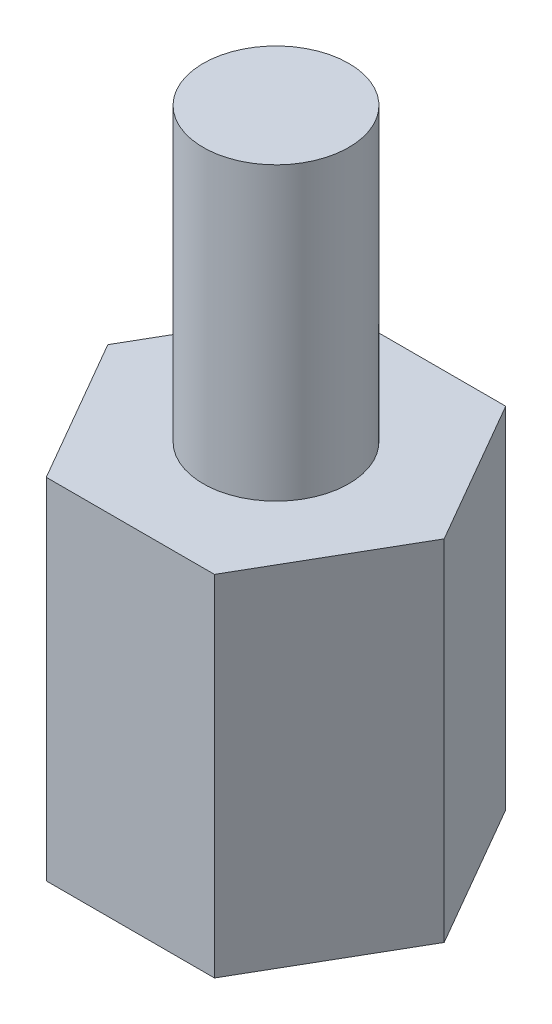
ISO-10303-21;
HEADER;
FILE_DESCRIPTION(('STEP AP214'),'2;1');
FILE_NAME('part.step','',(''),(''),'','','');
FILE_SCHEMA(('AUTOMOTIVE_DESIGN { 1 0 10303 214 1 1 1 1 }'));
ENDSEC;
DATA;
#1=APPLICATION_CONTEXT('core data for automotive mechanical design processes');
#2=APPLICATION_PROTOCOL_DEFINITION('international standard','automotive_design',2000,#1);
#3=PRODUCT_CONTEXT('',#1,'mechanical');
#4=PRODUCT('Part','Part','',(#3));
#5=PRODUCT_RELATED_PRODUCT_CATEGORY('part','',(#4));
#6=PRODUCT_DEFINITION_FORMATION('','',#4);
#7=PRODUCT_DEFINITION_CONTEXT('part definition',#1,'design');
#8=PRODUCT_DEFINITION('design','',#6,#7);
#9=PRODUCT_DEFINITION_SHAPE('','',#8);
#10=(LENGTH_UNIT() NAMED_UNIT(*) SI_UNIT(.MILLI.,.METRE.));
#11=(NAMED_UNIT(*) PLANE_ANGLE_UNIT() SI_UNIT($,.RADIAN.));
#12=(NAMED_UNIT(*) SI_UNIT($,.STERADIAN.) SOLID_ANGLE_UNIT());
#13=UNCERTAINTY_MEASURE_WITH_UNIT(LENGTH_MEASURE(1.E-05),#10,'distance_accuracy_value','');
#14=(GEOMETRIC_REPRESENTATION_CONTEXT(3) GLOBAL_UNCERTAINTY_ASSIGNED_CONTEXT((#13)) GLOBAL_UNIT_ASSIGNED_CONTEXT((#10,
#11,#12)) REPRESENTATION_CONTEXT('',''));
#15=CARTESIAN_POINT('',(0.,0.,0.));
#16=DIRECTION('',(0.,0.,1.));
#17=DIRECTION('',(1.,0.,0.));
#18=AXIS2_PLACEMENT_3D('',#15,#16,#17);
#19=CARTESIAN_POINT('',(0.,11.,0.));
#20=DIRECTION('',(0.,1.,0.));
#21=DIRECTION('',(0.,0.,1.));
#22=AXIS2_PLACEMENT_3D('',#19,#20,#21);
#23=PLANE('',#22);
#24=CARTESIAN_POINT('',(0.,11.,0.));
#25=DIRECTION('',(0.,-1.,0.));
#26=DIRECTION('',(0.,0.,-1.));
#27=AXIS2_PLACEMENT_3D('',#24,#25,#26);
#28=CIRCLE('',#27,1.25);
#29=CARTESIAN_POINT('',(0.,11.,-1.25));
#30=VERTEX_POINT('',#29);
#31=EDGE_CURVE('P0_E18',#30,#30,#28,.T.);
#32=ORIENTED_EDGE('',*,*,#31,.F.);
#33=EDGE_LOOP('',(#32));
#34=FACE_BOUND('',#33,.T.);
#35=ADVANCED_FACE('P0_F15',(#34),#23,.T.);
#36=CARTESIAN_POINT('',(0.,6.,0.));
#37=DIRECTION('',(0.,1.,0.));
#38=DIRECTION('',(0.,0.,1.));
#39=AXIS2_PLACEMENT_3D('',#36,#37,#38);
#40=PLANE('',#39);
#41=CARTESIAN_POINT('',(0.,6.,0.));
#42=DIRECTION('',(0.,-1.,0.));
#43=DIRECTION('',(0.,0.,-1.));
#44=AXIS2_PLACEMENT_3D('',#41,#42,#43);
#45=CIRCLE('',#44,1.25);
#46=CARTESIAN_POINT('',(0.,6.,-1.25));
#47=VERTEX_POINT('',#46);
#48=EDGE_CURVE('P0_E10',#47,#47,#45,.F.);
#49=ORIENTED_EDGE('',*,*,#48,.F.);
#50=EDGE_LOOP('',(#49));
#51=FACE_BOUND('',#50,.T.);
#52=ADVANCED_FACE('P0_F30',(#51),#40,.F.);
#53=CARTESIAN_POINT('',(0.,11.,0.));
#54=DIRECTION('',(0.,-1.,0.));
#55=DIRECTION('',(0.,0.,-1.));
#56=AXIS2_PLACEMENT_3D('',#53,#54,#55);
#57=CYLINDRICAL_SURFACE('',#56,1.25);
#58=ORIENTED_EDGE('',*,*,#48,.T.);
#59=EDGE_LOOP('',(#58));
#60=FACE_BOUND('',#59,.T.);
#61=ORIENTED_EDGE('',*,*,#31,.T.);
#62=EDGE_LOOP('',(#61));
#63=FACE_BOUND('',#62,.T.);
#64=ADVANCED_FACE('P0_F27',(#60,#63),#57,.T.);
#65=CLOSED_SHELL('',(#35,#52,#64));
#66=MANIFOLD_SOLID_BREP('P0_B1',#65);
#67=CARTESIAN_POINT('',(1.44337567297406,6.,2.50000000000001));
#68=DIRECTION('',(-0.866025403784439,0.,-0.5));
#69=DIRECTION('',(-0.5,0.,0.866025403784439));
#70=AXIS2_PLACEMENT_3D('',#67,#68,#69);
#71=PLANE('',#70);
#72=DIRECTION('',(0.,1.,0.));
#73=VECTOR('',#72,1.);
#74=CARTESIAN_POINT('',(2.88675134594813,6.,0.));
#75=LINE('',#74,#73);
#76=CARTESIAN_POINT('',(2.88675134594813,0.,0.));
#77=VERTEX_POINT('',#76);
#78=CARTESIAN_POINT('',(2.88675134594813,6.,0.));
#79=VERTEX_POINT('',#78);
#80=EDGE_CURVE('P1_E66',#77,#79,#75,.T.);
#81=ORIENTED_EDGE('',*,*,#80,.T.);
#82=DIRECTION('',(0.5,0.,-0.866025403784439));
#83=VECTOR('',#82,1.);
#84=CARTESIAN_POINT('',(1.44337567297406,6.,2.50000000000001));
#85=LINE('',#84,#83);
#86=CARTESIAN_POINT('',(1.44337567297406,6.,2.50000000000001));
#87=VERTEX_POINT('',#86);
#88=EDGE_CURVE('P1_E106',#87,#79,#85,.T.);
#89=ORIENTED_EDGE('',*,*,#88,.F.);
#90=DIRECTION('',(0.,1.,0.));
#91=VECTOR('',#90,1.);
#92=CARTESIAN_POINT('',(1.44337567297406,6.,2.50000000000001));
#93=LINE('',#92,#91);
#94=CARTESIAN_POINT('',(1.44337567297406,0.,2.50000000000001));
#95=VERTEX_POINT('',#94);
#96=EDGE_CURVE('P1_E93',#87,#95,#93,.F.);
#97=ORIENTED_EDGE('',*,*,#96,.T.);
#98=DIRECTION('',(0.5,0.,-0.866025403784439));
#99=VECTOR('',#98,1.);
#100=CARTESIAN_POINT('',(1.44337567297406,0.,2.50000000000001));
#101=LINE('',#100,#99);
#102=EDGE_CURVE('P1_E107',#95,#77,#101,.T.);
#103=ORIENTED_EDGE('',*,*,#102,.T.);
#104=EDGE_LOOP('',(#81,#89,#97,#103));
#105=FACE_BOUND('',#104,.T.);
#106=ADVANCED_FACE('P1_F17',(#105),#71,.F.);
#107=CARTESIAN_POINT('',(2.88675134594813,6.,0.));
#108=DIRECTION('',(-0.866025403784439,0.,0.5));
#109=DIRECTION('',(0.5,0.,0.866025403784439));
#110=AXIS2_PLACEMENT_3D('',#107,#108,#109);
#111=PLANE('',#110);
#112=DIRECTION('',(0.,1.,0.));
#113=VECTOR('',#112,1.);
#114=CARTESIAN_POINT('',(1.44337567297406,6.,-2.50000000000001));
#115=LINE('',#114,#113);
#116=CARTESIAN_POINT('',(1.44337567297406,0.,-2.50000000000001));
#117=VERTEX_POINT('',#116);
#118=CARTESIAN_POINT('',(1.44337567297406,6.,-2.50000000000001));
#119=VERTEX_POINT('',#118);
#120=EDGE_CURVE('P1_E73',#117,#119,#115,.T.);
#121=ORIENTED_EDGE('',*,*,#120,.T.);
#122=DIRECTION('',(-0.5,0.,-0.866025403784439));
#123=VECTOR('',#122,1.);
#124=CARTESIAN_POINT('',(2.88675134594813,6.,0.));
#125=LINE('',#124,#123);
#126=EDGE_CURVE('P1_E108',#79,#119,#125,.T.);
#127=ORIENTED_EDGE('',*,*,#126,.F.);
#128=ORIENTED_EDGE('',*,*,#80,.F.);
#129=DIRECTION('',(-0.5,0.,-0.866025403784439));
#130=VECTOR('',#129,1.);
#131=CARTESIAN_POINT('',(2.88675134594813,0.,0.));
#132=LINE('',#131,#130);
#133=EDGE_CURVE('P1_E86',#77,#117,#132,.T.);
#134=ORIENTED_EDGE('',*,*,#133,.T.);
#135=EDGE_LOOP('',(#121,#127,#128,#134));
#136=FACE_BOUND('',#135,.T.);
#137=ADVANCED_FACE('P1_F92',(#136),#111,.F.);
#138=CARTESIAN_POINT('',(1.44337567297406,6.,-2.50000000000001));
#139=DIRECTION('',(0.,0.,1.));
#140=DIRECTION('',(1.,0.,0.));
#141=AXIS2_PLACEMENT_3D('',#138,#139,#140);
#142=PLANE('',#141);
#143=DIRECTION('',(0.,1.,0.));
#144=VECTOR('',#143,1.);
#145=CARTESIAN_POINT('',(-1.44337567297407,6.,-2.50000000000001));
#146=LINE('',#145,#144);
#147=CARTESIAN_POINT('',(-1.44337567297407,0.,-2.50000000000001));
#148=VERTEX_POINT('',#147);
#149=CARTESIAN_POINT('',(-1.44337567297407,6.,-2.50000000000001));
#150=VERTEX_POINT('',#149);
#151=EDGE_CURVE('P1_E79',#148,#150,#146,.T.);
#152=ORIENTED_EDGE('',*,*,#151,.T.);
#153=DIRECTION('',(1.,0.,0.));
#154=VECTOR('',#153,1.);
#155=CARTESIAN_POINT('',(0.,6.,-2.50000000000001));
#156=LINE('',#155,#154);
#157=EDGE_CURVE('P1_E78',#119,#150,#156,.F.);
#158=ORIENTED_EDGE('',*,*,#157,.F.);
#159=ORIENTED_EDGE('',*,*,#120,.F.);
#160=DIRECTION('',(1.,0.,0.));
#161=VECTOR('',#160,1.);
#162=CARTESIAN_POINT('',(0.,0.,-2.50000000000001));
#163=LINE('',#162,#161);
#164=EDGE_CURVE('P1_E77',#117,#148,#163,.F.);
#165=ORIENTED_EDGE('',*,*,#164,.T.);
#166=EDGE_LOOP('',(#152,#158,#159,#165));
#167=FACE_BOUND('',#166,.T.);
#168=ADVANCED_FACE('P1_F76',(#167),#142,.F.);
#169=CARTESIAN_POINT('',(-1.44337567297407,6.,-2.50000000000001));
#170=DIRECTION('',(0.866025403784439,0.,0.5));
#171=DIRECTION('',(0.5,0.,-0.866025403784439));
#172=AXIS2_PLACEMENT_3D('',#169,#170,#171);
#173=PLANE('',#172);
#174=DIRECTION('',(0.,1.,0.));
#175=VECTOR('',#174,1.);
#176=CARTESIAN_POINT('',(-2.88675134594814,6.,0.));
#177=LINE('',#176,#175);
#178=CARTESIAN_POINT('',(-2.88675134594814,0.,0.));
#179=VERTEX_POINT('',#178);
#180=CARTESIAN_POINT('',(-2.88675134594814,6.,0.));
#181=VERTEX_POINT('',#180);
#182=EDGE_CURVE('P1_E100',#179,#181,#177,.T.);
#183=ORIENTED_EDGE('',*,*,#182,.T.);
#184=DIRECTION('',(-0.5,0.,0.866025403784439));
#185=VECTOR('',#184,1.);
#186=CARTESIAN_POINT('',(-1.44337567297407,6.,-2.50000000000001));
#187=LINE('',#186,#185);
#188=EDGE_CURVE('P1_E110',#150,#181,#187,.T.);
#189=ORIENTED_EDGE('',*,*,#188,.F.);
#190=ORIENTED_EDGE('',*,*,#151,.F.);
#191=DIRECTION('',(-0.5,0.,0.866025403784439));
#192=VECTOR('',#191,1.);
#193=CARTESIAN_POINT('',(-1.44337567297407,0.,-2.50000000000001));
#194=LINE('',#193,#192);
#195=EDGE_CURVE('P1_E90',#148,#179,#194,.T.);
#196=ORIENTED_EDGE('',*,*,#195,.T.);
#197=EDGE_LOOP('',(#183,#189,#190,#196));
#198=FACE_BOUND('',#197,.T.);
#199=ADVANCED_FACE('P1_F122',(#198),#173,.F.);
#200=CARTESIAN_POINT('',(-2.88675134594814,6.,0.));
#201=DIRECTION('',(0.866025403784439,0.,-0.5));
#202=DIRECTION('',(-0.5,0.,-0.866025403784439));
#203=AXIS2_PLACEMENT_3D('',#200,#201,#202);
#204=PLANE('',#203);
#205=DIRECTION('',(0.,1.,0.));
#206=VECTOR('',#205,1.);
#207=CARTESIAN_POINT('',(-1.44337567297407,6.,2.50000000000001));
#208=LINE('',#207,#206);
#209=CARTESIAN_POINT('',(-1.44337567297407,0.,2.50000000000001));
#210=VERTEX_POINT('',#209);
#211=CARTESIAN_POINT('',(-1.44337567297407,6.,2.50000000000001));
#212=VERTEX_POINT('',#211);
#213=EDGE_CURVE('P1_E95',#210,#212,#208,.T.);
#214=ORIENTED_EDGE('',*,*,#213,.T.);
#215=DIRECTION('',(0.5,0.,0.866025403784439));
#216=VECTOR('',#215,1.);
#217=CARTESIAN_POINT('',(-2.88675134594814,6.,0.));
#218=LINE('',#217,#216);
#219=EDGE_CURVE('P1_E33',#181,#212,#218,.T.);
#220=ORIENTED_EDGE('',*,*,#219,.F.);
#221=ORIENTED_EDGE('',*,*,#182,.F.);
#222=DIRECTION('',(0.5,0.,0.866025403784439));
#223=VECTOR('',#222,1.);
#224=CARTESIAN_POINT('',(-2.88675134594814,0.,0.));
#225=LINE('',#224,#223);
#226=EDGE_CURVE('P1_E119',#179,#210,#225,.T.);
#227=ORIENTED_EDGE('',*,*,#226,.T.);
#228=EDGE_LOOP('',(#214,#220,#221,#227));
#229=FACE_BOUND('',#228,.T.);
#230=ADVANCED_FACE('P1_F150',(#229),#204,.F.);
#231=CARTESIAN_POINT('',(-1.44337567297407,6.,2.50000000000001));
#232=DIRECTION('',(0.,0.,-1.));
#233=DIRECTION('',(-1.,0.,0.));
#234=AXIS2_PLACEMENT_3D('',#231,#232,#233);
#235=PLANE('',#234);
#236=ORIENTED_EDGE('',*,*,#96,.F.);
#237=DIRECTION('',(1.,0.,0.));
#238=VECTOR('',#237,1.);
#239=CARTESIAN_POINT('',(0.,6.,2.50000000000001));
#240=LINE('',#239,#238);
#241=EDGE_CURVE('P1_E124',#212,#87,#240,.T.);
#242=ORIENTED_EDGE('',*,*,#241,.F.);
#243=ORIENTED_EDGE('',*,*,#213,.F.);
#244=DIRECTION('',(1.,0.,0.));
#245=VECTOR('',#244,1.);
#246=CARTESIAN_POINT('',(0.,0.,2.50000000000001));
#247=LINE('',#246,#245);
#248=EDGE_CURVE('P1_E116',#210,#95,#247,.T.);
#249=ORIENTED_EDGE('',*,*,#248,.T.);
#250=EDGE_LOOP('',(#236,#242,#243,#249));
#251=FACE_BOUND('',#250,.T.);
#252=ADVANCED_FACE('P1_F145',(#251),#235,.F.);
#253=CARTESIAN_POINT('',(0.,0.,0.));
#254=DIRECTION('',(0.,1.,0.));
#255=DIRECTION('',(0.,0.,1.));
#256=AXIS2_PLACEMENT_3D('',#253,#254,#255);
#257=PLANE('',#256);
#258=CARTESIAN_POINT('',(0.,0.,0.));
#259=DIRECTION('',(0.,-1.,0.));
#260=DIRECTION('',(0.,0.,-1.));
#261=AXIS2_PLACEMENT_3D('',#258,#259,#260);
#262=CIRCLE('',#261,1.25);
#263=CARTESIAN_POINT('',(0.,0.,-1.25));
#264=VERTEX_POINT('',#263);
#265=EDGE_CURVE('P1_E20',#264,#264,#262,.F.);
#266=ORIENTED_EDGE('',*,*,#265,.T.);
#267=EDGE_LOOP('',(#266));
#268=FACE_BOUND('',#267,.T.);
#269=ORIENTED_EDGE('',*,*,#248,.F.);
#270=ORIENTED_EDGE('',*,*,#226,.F.);
#271=ORIENTED_EDGE('',*,*,#195,.F.);
#272=ORIENTED_EDGE('',*,*,#164,.F.);
#273=ORIENTED_EDGE('',*,*,#133,.F.);
#274=ORIENTED_EDGE('',*,*,#102,.F.);
#275=EDGE_LOOP('',(#269,#270,#271,#272,#273,#274));
#276=FACE_BOUND('',#275,.T.);
#277=ADVANCED_FACE('P1_F84',(#268,#276),#257,.F.);
#278=CARTESIAN_POINT('',(0.,6.,0.));
#279=DIRECTION('',(0.,1.,0.));
#280=DIRECTION('',(0.,0.,1.));
#281=AXIS2_PLACEMENT_3D('',#278,#279,#280);
#282=PLANE('',#281);
#283=CARTESIAN_POINT('',(0.,6.,0.));
#284=DIRECTION('',(0.,-1.,0.));
#285=DIRECTION('',(0.,0.,-1.));
#286=AXIS2_PLACEMENT_3D('',#283,#284,#285);
#287=CIRCLE('',#286,1.25);
#288=CARTESIAN_POINT('',(0.,6.,-1.25));
#289=VERTEX_POINT('',#288);
#290=EDGE_CURVE('P1_E11',#289,#289,#287,.T.);
#291=ORIENTED_EDGE('',*,*,#290,.T.);
#292=EDGE_LOOP('',(#291));
#293=FACE_BOUND('',#292,.T.);
#294=ORIENTED_EDGE('',*,*,#219,.T.);
#295=ORIENTED_EDGE('',*,*,#241,.T.);
#296=ORIENTED_EDGE('',*,*,#88,.T.);
#297=ORIENTED_EDGE('',*,*,#126,.T.);
#298=ORIENTED_EDGE('',*,*,#157,.T.);
#299=ORIENTED_EDGE('',*,*,#188,.T.);
#300=EDGE_LOOP('',(#294,#295,#296,#297,#298,#299));
#301=FACE_BOUND('',#300,.T.);
#302=ADVANCED_FACE('P1_F135',(#293,#301),#282,.T.);
#303=CARTESIAN_POINT('',(0.,6.,0.));
#304=DIRECTION('',(0.,-1.,0.));
#305=DIRECTION('',(0.,0.,-1.));
#306=AXIS2_PLACEMENT_3D('',#303,#304,#305);
#307=CYLINDRICAL_SURFACE('',#306,1.25);
#308=ORIENTED_EDGE('',*,*,#265,.F.);
#309=EDGE_LOOP('',(#308));
#310=FACE_BOUND('',#309,.T.);
#311=ORIENTED_EDGE('',*,*,#290,.F.);
#312=EDGE_LOOP('',(#311));
#313=FACE_BOUND('',#312,.T.);
#314=ADVANCED_FACE('P1_F132',(#310,#313),#307,.F.);
#315=CLOSED_SHELL('',(#106,#137,#168,#199,#230,#252,#277,#302,#314));
#316=MANIFOLD_SOLID_BREP('P1_B1',#315);
#317=ADVANCED_BREP_SHAPE_REPRESENTATION('',(#18,#66,#316),#14);
#318=SHAPE_DEFINITION_REPRESENTATION(#9,#317);
ENDSEC;
END-ISO-10303-21;
